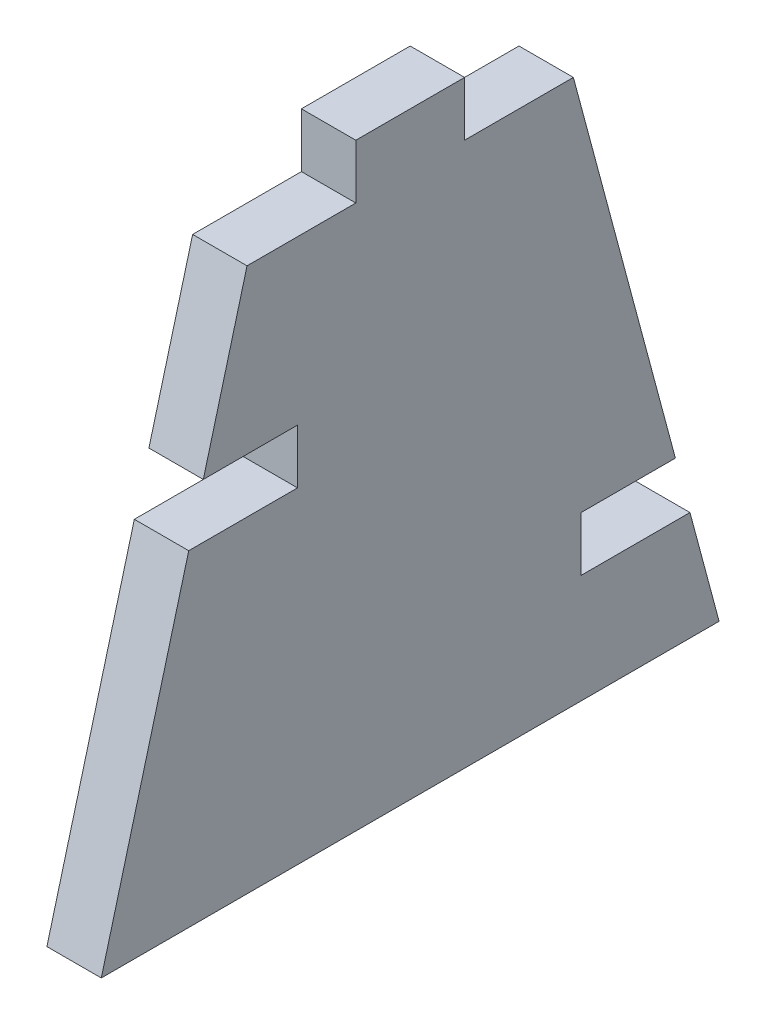
ISO-10303-21;
HEADER;
FILE_DESCRIPTION(('STEP AP214'),'2;1');
FILE_NAME('part.step','',(''),(''),'','','');
FILE_SCHEMA(('AUTOMOTIVE_DESIGN { 1 0 10303 214 1 1 1 1 }'));
ENDSEC;
DATA;
#1=APPLICATION_CONTEXT('core data for automotive mechanical design processes');
#2=APPLICATION_PROTOCOL_DEFINITION('international standard','automotive_design',2000,#1);
#3=PRODUCT_CONTEXT('',#1,'mechanical');
#4=PRODUCT('Part','Part','',(#3));
#5=PRODUCT_RELATED_PRODUCT_CATEGORY('part','',(#4));
#6=PRODUCT_DEFINITION_FORMATION('','',#4);
#7=PRODUCT_DEFINITION_CONTEXT('part definition',#1,'design');
#8=PRODUCT_DEFINITION('design','',#6,#7);
#9=PRODUCT_DEFINITION_SHAPE('','',#8);
#10=(LENGTH_UNIT() NAMED_UNIT(*) SI_UNIT(.MILLI.,.METRE.));
#11=(NAMED_UNIT(*) PLANE_ANGLE_UNIT() SI_UNIT($,.RADIAN.));
#12=(NAMED_UNIT(*) SI_UNIT($,.STERADIAN.) SOLID_ANGLE_UNIT());
#13=UNCERTAINTY_MEASURE_WITH_UNIT(LENGTH_MEASURE(1.E-05),#10,'distance_accuracy_value','');
#14=(GEOMETRIC_REPRESENTATION_CONTEXT(3) GLOBAL_UNCERTAINTY_ASSIGNED_CONTEXT((#13)) GLOBAL_UNIT_ASSIGNED_CONTEXT((#10,
#11,#12)) REPRESENTATION_CONTEXT('',''));
#15=CARTESIAN_POINT('',(0.,0.,0.));
#16=DIRECTION('',(0.,0.,1.));
#17=DIRECTION('',(1.,0.,0.));
#18=AXIS2_PLACEMENT_3D('',#15,#16,#17);
#19=CARTESIAN_POINT('',(10.,0.,56.7949192431127));
#20=DIRECTION('',(0.,-0.258819045102525,-0.965925826289067));
#21=DIRECTION('',(0.,0.965925826289067,-0.258819045102525));
#22=AXIS2_PLACEMENT_3D('',#19,#20,#21);
#23=PLANE('',#22);
#24=DIRECTION('',(0.,-0.965925826289067,0.258819045102524));
#25=VECTOR('',#24,1.);
#26=CARTESIAN_POINT('',(0.,0.,56.7949192431127));
#27=LINE('',#26,#25);
#28=CARTESIAN_POINT('',(0.,60.,40.7179676972451));
#29=VERTEX_POINT('',#28);
#30=CARTESIAN_POINT('',(0.,0.,56.7949192431127));
#31=VERTEX_POINT('',#30);
#32=EDGE_CURVE('E178',#29,#31,#27,.T.);
#33=ORIENTED_EDGE('',*,*,#32,.T.);
#34=DIRECTION('',(-1.,0.,0.));
#35=VECTOR('',#34,1.);
#36=CARTESIAN_POINT('',(10.,0.,56.7949192431127));
#37=LINE('',#36,#35);
#38=CARTESIAN_POINT('',(10.,0.,56.7949192431127));
#39=VERTEX_POINT('',#38);
#40=EDGE_CURVE('E11',#39,#31,#37,.T.);
#41=ORIENTED_EDGE('',*,*,#40,.F.);
#42=DIRECTION('',(0.,-0.965925826289067,0.258819045102524));
#43=VECTOR('',#42,1.);
#44=CARTESIAN_POINT('',(10.,0.,56.7949192431127));
#45=LINE('',#44,#43);
#46=CARTESIAN_POINT('',(10.,60.,40.7179676972451));
#47=VERTEX_POINT('',#46);
#48=EDGE_CURVE('E208',#47,#39,#45,.T.);
#49=ORIENTED_EDGE('',*,*,#48,.F.);
#50=DIRECTION('',(-1.,0.,0.));
#51=VECTOR('',#50,1.);
#52=CARTESIAN_POINT('',(10.,60.,40.7179676972451));
#53=LINE('',#52,#51);
#54=EDGE_CURVE('E174',#47,#29,#53,.T.);
#55=ORIENTED_EDGE('',*,*,#54,.T.);
#56=EDGE_LOOP('',(#33,#41,#49,#55));
#57=FACE_BOUND('',#56,.T.);
#58=ADVANCED_FACE('F34',(#57),#23,.F.);
#59=CARTESIAN_POINT('',(10.,0.,-56.7949192431127));
#60=DIRECTION('',(0.,1.,0.));
#61=DIRECTION('',(0.,0.,1.));
#62=AXIS2_PLACEMENT_3D('',#59,#60,#61);
#63=PLANE('',#62);
#64=DIRECTION('',(0.,0.,-1.));
#65=VECTOR('',#64,1.);
#66=CARTESIAN_POINT('',(0.,0.,-56.7949192431127));
#67=LINE('',#66,#65);
#68=CARTESIAN_POINT('',(0.,0.,-56.7949192431127));
#69=VERTEX_POINT('',#68);
#70=EDGE_CURVE('E181',#31,#69,#67,.T.);
#71=ORIENTED_EDGE('',*,*,#70,.T.);
#72=DIRECTION('',(-1.,0.,0.));
#73=VECTOR('',#72,1.);
#74=CARTESIAN_POINT('',(10.,0.,-56.7949192431127));
#75=LINE('',#74,#73);
#76=CARTESIAN_POINT('',(10.,0.,-56.7949192431127));
#77=VERTEX_POINT('',#76);
#78=EDGE_CURVE('E42',#77,#69,#75,.T.);
#79=ORIENTED_EDGE('',*,*,#78,.F.);
#80=DIRECTION('',(0.,0.,-1.));
#81=VECTOR('',#80,1.);
#82=CARTESIAN_POINT('',(10.,0.,-56.7949192431127));
#83=LINE('',#82,#81);
#84=EDGE_CURVE('E117',#39,#77,#83,.T.);
#85=ORIENTED_EDGE('',*,*,#84,.F.);
#86=ORIENTED_EDGE('',*,*,#40,.T.);
#87=EDGE_LOOP('',(#71,#79,#85,#86));
#88=FACE_BOUND('',#87,.T.);
#89=ADVANCED_FACE('F306',(#88),#63,.F.);
#90=CARTESIAN_POINT('',(10.,0.,-56.7949192431127));
#91=DIRECTION('',(0.,-0.258819045102525,0.965925826289067));
#92=DIRECTION('',(0.,-0.965925826289067,-0.258819045102525));
#93=AXIS2_PLACEMENT_3D('',#90,#91,#92);
#94=PLANE('',#93);
#95=DIRECTION('',(0.,0.965925826289067,0.258819045102525));
#96=VECTOR('',#95,1.);
#97=CARTESIAN_POINT('',(0.,0.,-56.7949192431127));
#98=LINE('',#97,#96);
#99=CARTESIAN_POINT('',(0.,20.,-51.4359353944902));
#100=VERTEX_POINT('',#99);
#101=EDGE_CURVE('E183',#69,#100,#98,.T.);
#102=ORIENTED_EDGE('',*,*,#101,.T.);
#103=DIRECTION('',(-1.,0.,0.));
#104=VECTOR('',#103,1.);
#105=CARTESIAN_POINT('',(10.,20.,-51.4359353944902));
#106=LINE('',#105,#104);
#107=CARTESIAN_POINT('',(10.,20.,-51.4359353944902));
#108=VERTEX_POINT('',#107);
#109=EDGE_CURVE('E239',#108,#100,#106,.T.);
#110=ORIENTED_EDGE('',*,*,#109,.F.);
#111=DIRECTION('',(0.,0.965925826289067,0.258819045102525));
#112=VECTOR('',#111,1.);
#113=CARTESIAN_POINT('',(10.,0.,-56.7949192431127));
#114=LINE('',#113,#112);
#115=EDGE_CURVE('E247',#77,#108,#114,.T.);
#116=ORIENTED_EDGE('',*,*,#115,.F.);
#117=ORIENTED_EDGE('',*,*,#78,.T.);
#118=EDGE_LOOP('',(#102,#110,#116,#117));
#119=FACE_BOUND('',#118,.T.);
#120=ADVANCED_FACE('F245',(#119),#94,.F.);
#121=CARTESIAN_POINT('',(10.,20.,-31.4359353944901));
#122=DIRECTION('',(0.,-1.,0.));
#123=DIRECTION('',(0.,0.,-1.));
#124=AXIS2_PLACEMENT_3D('',#121,#122,#123);
#125=PLANE('',#124);
#126=DIRECTION('',(0.,0.,1.));
#127=VECTOR('',#126,1.);
#128=CARTESIAN_POINT('',(0.,20.,-31.4359353944901));
#129=LINE('',#128,#127);
#130=CARTESIAN_POINT('',(0.,20.,-31.4359353944901));
#131=VERTEX_POINT('',#130);
#132=EDGE_CURVE('E185',#100,#131,#129,.T.);
#133=ORIENTED_EDGE('',*,*,#132,.T.);
#134=DIRECTION('',(-1.,0.,0.));
#135=VECTOR('',#134,1.);
#136=CARTESIAN_POINT('',(10.,20.,-31.4359353944901));
#137=LINE('',#136,#135);
#138=CARTESIAN_POINT('',(10.,20.,-31.4359353944901));
#139=VERTEX_POINT('',#138);
#140=EDGE_CURVE('E236',#139,#131,#137,.T.);
#141=ORIENTED_EDGE('',*,*,#140,.F.);
#142=DIRECTION('',(0.,0.,1.));
#143=VECTOR('',#142,1.);
#144=CARTESIAN_POINT('',(10.,20.,-31.4359353944901));
#145=LINE('',#144,#143);
#146=EDGE_CURVE('E265',#108,#139,#145,.T.);
#147=ORIENTED_EDGE('',*,*,#146,.F.);
#148=ORIENTED_EDGE('',*,*,#109,.T.);
#149=EDGE_LOOP('',(#133,#141,#147,#148));
#150=FACE_BOUND('',#149,.T.);
#151=ADVANCED_FACE('F256',(#150),#125,.F.);
#152=CARTESIAN_POINT('',(10.,30.,-31.4359353944901));
#153=DIRECTION('',(0.,0.,1.));
#154=DIRECTION('',(1.,0.,0.));
#155=AXIS2_PLACEMENT_3D('',#152,#153,#154);
#156=PLANE('',#155);
#157=DIRECTION('',(0.,1.,0.));
#158=VECTOR('',#157,1.);
#159=CARTESIAN_POINT('',(0.,30.,-31.4359353944901));
#160=LINE('',#159,#158);
#161=CARTESIAN_POINT('',(0.,30.,-31.4359353944901));
#162=VERTEX_POINT('',#161);
#163=EDGE_CURVE('E187',#131,#162,#160,.T.);
#164=ORIENTED_EDGE('',*,*,#163,.T.);
#165=DIRECTION('',(-1.,0.,0.));
#166=VECTOR('',#165,1.);
#167=CARTESIAN_POINT('',(10.,30.,-31.4359353944901));
#168=LINE('',#167,#166);
#169=CARTESIAN_POINT('',(10.,30.,-31.4359353944901));
#170=VERTEX_POINT('',#169);
#171=EDGE_CURVE('E233',#170,#162,#168,.T.);
#172=ORIENTED_EDGE('',*,*,#171,.F.);
#173=DIRECTION('',(0.,1.,0.));
#174=VECTOR('',#173,1.);
#175=CARTESIAN_POINT('',(10.,30.,-31.4359353944901));
#176=LINE('',#175,#174);
#177=EDGE_CURVE('E262',#139,#170,#176,.T.);
#178=ORIENTED_EDGE('',*,*,#177,.F.);
#179=ORIENTED_EDGE('',*,*,#140,.T.);
#180=EDGE_LOOP('',(#164,#172,#178,#179));
#181=FACE_BOUND('',#180,.T.);
#182=ADVANCED_FACE('F260',(#181),#156,.F.);
#183=CARTESIAN_POINT('',(10.,30.,-48.7564434701789));
#184=DIRECTION('',(0.,1.,0.));
#185=DIRECTION('',(0.,0.,1.));
#186=AXIS2_PLACEMENT_3D('',#183,#184,#185);
#187=PLANE('',#186);
#188=DIRECTION('',(0.,0.,-1.));
#189=VECTOR('',#188,1.);
#190=CARTESIAN_POINT('',(0.,30.,-48.7564434701789));
#191=LINE('',#190,#189);
#192=CARTESIAN_POINT('',(0.,30.,-48.7564434701789));
#193=VERTEX_POINT('',#192);
#194=EDGE_CURVE('E189',#162,#193,#191,.T.);
#195=ORIENTED_EDGE('',*,*,#194,.T.);
#196=DIRECTION('',(-1.,0.,0.));
#197=VECTOR('',#196,1.);
#198=CARTESIAN_POINT('',(10.,30.,-48.7564434701789));
#199=LINE('',#198,#197);
#200=CARTESIAN_POINT('',(10.,30.,-48.7564434701789));
#201=VERTEX_POINT('',#200);
#202=EDGE_CURVE('E230',#201,#193,#199,.T.);
#203=ORIENTED_EDGE('',*,*,#202,.F.);
#204=DIRECTION('',(0.,0.,-1.));
#205=VECTOR('',#204,1.);
#206=CARTESIAN_POINT('',(10.,30.,-48.7564434701789));
#207=LINE('',#206,#205);
#208=EDGE_CURVE('E264',#170,#201,#207,.T.);
#209=ORIENTED_EDGE('',*,*,#208,.F.);
#210=ORIENTED_EDGE('',*,*,#171,.T.);
#211=EDGE_LOOP('',(#195,#203,#209,#210));
#212=FACE_BOUND('',#211,.T.);
#213=ADVANCED_FACE('F319',(#212),#187,.F.);
#214=CARTESIAN_POINT('',(10.,30.,-48.7564434701789));
#215=DIRECTION('',(0.,-0.258819045102525,0.965925826289067));
#216=DIRECTION('',(0.,-0.965925826289067,-0.258819045102525));
#217=AXIS2_PLACEMENT_3D('',#214,#215,#216);
#218=PLANE('',#217);
#219=DIRECTION('',(0.,0.965925826289067,0.258819045102525));
#220=VECTOR('',#219,1.);
#221=CARTESIAN_POINT('',(0.,30.,-48.7564434701789));
#222=LINE('',#221,#220);
#223=CARTESIAN_POINT('',(0.,100.,-30.));
#224=VERTEX_POINT('',#223);
#225=EDGE_CURVE('E191',#193,#224,#222,.T.);
#226=ORIENTED_EDGE('',*,*,#225,.T.);
#227=DIRECTION('',(-1.,0.,0.));
#228=VECTOR('',#227,1.);
#229=CARTESIAN_POINT('',(10.,100.,-30.));
#230=LINE('',#229,#228);
#231=CARTESIAN_POINT('',(10.,100.,-30.));
#232=VERTEX_POINT('',#231);
#233=EDGE_CURVE('E227',#232,#224,#230,.T.);
#234=ORIENTED_EDGE('',*,*,#233,.F.);
#235=DIRECTION('',(0.,0.965925826289067,0.258819045102525));
#236=VECTOR('',#235,1.);
#237=CARTESIAN_POINT('',(10.,30.,-48.7564434701789));
#238=LINE('',#237,#236);
#239=EDGE_CURVE('E267',#201,#232,#238,.T.);
#240=ORIENTED_EDGE('',*,*,#239,.F.);
#241=ORIENTED_EDGE('',*,*,#202,.T.);
#242=EDGE_LOOP('',(#226,#234,#240,#241));
#243=FACE_BOUND('',#242,.T.);
#244=ADVANCED_FACE('F322',(#243),#218,.F.);
#245=CARTESIAN_POINT('',(10.,100.,-30.));
#246=DIRECTION('',(0.,-1.,0.));
#247=DIRECTION('',(0.,0.,-1.));
#248=AXIS2_PLACEMENT_3D('',#245,#246,#247);
#249=PLANE('',#248);
#250=DIRECTION('',(0.,0.,1.));
#251=VECTOR('',#250,1.);
#252=CARTESIAN_POINT('',(0.,100.,-30.));
#253=LINE('',#252,#251);
#254=CARTESIAN_POINT('',(0.,100.,-10.));
#255=VERTEX_POINT('',#254);
#256=EDGE_CURVE('E193',#224,#255,#253,.T.);
#257=ORIENTED_EDGE('',*,*,#256,.T.);
#258=DIRECTION('',(-1.,0.,0.));
#259=VECTOR('',#258,1.);
#260=CARTESIAN_POINT('',(10.,100.,-10.));
#261=LINE('',#260,#259);
#262=CARTESIAN_POINT('',(10.,100.,-10.));
#263=VERTEX_POINT('',#262);
#264=EDGE_CURVE('E224',#263,#255,#261,.T.);
#265=ORIENTED_EDGE('',*,*,#264,.F.);
#266=DIRECTION('',(0.,0.,1.));
#267=VECTOR('',#266,1.);
#268=CARTESIAN_POINT('',(10.,100.,-30.));
#269=LINE('',#268,#267);
#270=EDGE_CURVE('E273',#232,#263,#269,.T.);
#271=ORIENTED_EDGE('',*,*,#270,.F.);
#272=ORIENTED_EDGE('',*,*,#233,.T.);
#273=EDGE_LOOP('',(#257,#265,#271,#272));
#274=FACE_BOUND('',#273,.T.);
#275=ADVANCED_FACE('F326',(#274),#249,.F.);
#276=CARTESIAN_POINT('',(10.,100.,-10.));
#277=DIRECTION('',(0.,0.,1.));
#278=DIRECTION('',(1.,0.,0.));
#279=AXIS2_PLACEMENT_3D('',#276,#277,#278);
#280=PLANE('',#279);
#281=DIRECTION('',(0.,1.,0.));
#282=VECTOR('',#281,1.);
#283=CARTESIAN_POINT('',(0.,100.,-10.));
#284=LINE('',#283,#282);
#285=CARTESIAN_POINT('',(0.,110.,-10.));
#286=VERTEX_POINT('',#285);
#287=EDGE_CURVE('E195',#255,#286,#284,.T.);
#288=ORIENTED_EDGE('',*,*,#287,.T.);
#289=DIRECTION('',(-1.,0.,0.));
#290=VECTOR('',#289,1.);
#291=CARTESIAN_POINT('',(10.,110.,-10.));
#292=LINE('',#291,#290);
#293=CARTESIAN_POINT('',(10.,110.,-10.));
#294=VERTEX_POINT('',#293);
#295=EDGE_CURVE('E221',#294,#286,#292,.T.);
#296=ORIENTED_EDGE('',*,*,#295,.F.);
#297=DIRECTION('',(0.,1.,0.));
#298=VECTOR('',#297,1.);
#299=CARTESIAN_POINT('',(10.,100.,-10.));
#300=LINE('',#299,#298);
#301=EDGE_CURVE('E275',#263,#294,#300,.T.);
#302=ORIENTED_EDGE('',*,*,#301,.F.);
#303=ORIENTED_EDGE('',*,*,#264,.T.);
#304=EDGE_LOOP('',(#288,#296,#302,#303));
#305=FACE_BOUND('',#304,.T.);
#306=ADVANCED_FACE('F330',(#305),#280,.F.);
#307=CARTESIAN_POINT('',(10.,110.,10.));
#308=DIRECTION('',(0.,-1.,0.));
#309=DIRECTION('',(0.,0.,-1.));
#310=AXIS2_PLACEMENT_3D('',#307,#308,#309);
#311=PLANE('',#310);
#312=DIRECTION('',(0.,0.,1.));
#313=VECTOR('',#312,1.);
#314=CARTESIAN_POINT('',(0.,110.,10.));
#315=LINE('',#314,#313);
#316=CARTESIAN_POINT('',(0.,110.,10.));
#317=VERTEX_POINT('',#316);
#318=EDGE_CURVE('E197',#286,#317,#315,.T.);
#319=ORIENTED_EDGE('',*,*,#318,.T.);
#320=DIRECTION('',(-1.,0.,0.));
#321=VECTOR('',#320,1.);
#322=CARTESIAN_POINT('',(10.,110.,10.));
#323=LINE('',#322,#321);
#324=CARTESIAN_POINT('',(10.,110.,10.));
#325=VERTEX_POINT('',#324);
#326=EDGE_CURVE('E218',#325,#317,#323,.T.);
#327=ORIENTED_EDGE('',*,*,#326,.F.);
#328=DIRECTION('',(0.,0.,1.));
#329=VECTOR('',#328,1.);
#330=CARTESIAN_POINT('',(10.,110.,10.));
#331=LINE('',#330,#329);
#332=EDGE_CURVE('E277',#294,#325,#331,.T.);
#333=ORIENTED_EDGE('',*,*,#332,.F.);
#334=ORIENTED_EDGE('',*,*,#295,.T.);
#335=EDGE_LOOP('',(#319,#327,#333,#334));
#336=FACE_BOUND('',#335,.T.);
#337=ADVANCED_FACE('F334',(#336),#311,.F.);
#338=CARTESIAN_POINT('',(10.,100.,10.));
#339=DIRECTION('',(0.,0.,-1.));
#340=DIRECTION('',(-1.,0.,0.));
#341=AXIS2_PLACEMENT_3D('',#338,#339,#340);
#342=PLANE('',#341);
#343=DIRECTION('',(0.,-1.,0.));
#344=VECTOR('',#343,1.);
#345=CARTESIAN_POINT('',(0.,100.,10.));
#346=LINE('',#345,#344);
#347=CARTESIAN_POINT('',(0.,100.,10.));
#348=VERTEX_POINT('',#347);
#349=EDGE_CURVE('E199',#317,#348,#346,.T.);
#350=ORIENTED_EDGE('',*,*,#349,.T.);
#351=DIRECTION('',(-1.,0.,0.));
#352=VECTOR('',#351,1.);
#353=CARTESIAN_POINT('',(10.,100.,10.));
#354=LINE('',#353,#352);
#355=CARTESIAN_POINT('',(10.,100.,10.));
#356=VERTEX_POINT('',#355);
#357=EDGE_CURVE('E215',#356,#348,#354,.T.);
#358=ORIENTED_EDGE('',*,*,#357,.F.);
#359=DIRECTION('',(0.,-1.,0.));
#360=VECTOR('',#359,1.);
#361=CARTESIAN_POINT('',(10.,100.,10.));
#362=LINE('',#361,#360);
#363=EDGE_CURVE('E279',#325,#356,#362,.T.);
#364=ORIENTED_EDGE('',*,*,#363,.F.);
#365=ORIENTED_EDGE('',*,*,#326,.T.);
#366=EDGE_LOOP('',(#350,#358,#364,#365));
#367=FACE_BOUND('',#366,.T.);
#368=ADVANCED_FACE('F338',(#367),#342,.F.);
#369=CARTESIAN_POINT('',(10.,100.,30.));
#370=DIRECTION('',(0.,-1.,0.));
#371=DIRECTION('',(0.,0.,-1.));
#372=AXIS2_PLACEMENT_3D('',#369,#370,#371);
#373=PLANE('',#372);
#374=DIRECTION('',(0.,0.,1.));
#375=VECTOR('',#374,1.);
#376=CARTESIAN_POINT('',(0.,100.,30.));
#377=LINE('',#376,#375);
#378=CARTESIAN_POINT('',(0.,100.,30.));
#379=VERTEX_POINT('',#378);
#380=EDGE_CURVE('E201',#348,#379,#377,.T.);
#381=ORIENTED_EDGE('',*,*,#380,.T.);
#382=DIRECTION('',(-1.,0.,0.));
#383=VECTOR('',#382,1.);
#384=CARTESIAN_POINT('',(10.,100.,30.));
#385=LINE('',#384,#383);
#386=CARTESIAN_POINT('',(10.,100.,30.));
#387=VERTEX_POINT('',#386);
#388=EDGE_CURVE('E212',#387,#379,#385,.T.);
#389=ORIENTED_EDGE('',*,*,#388,.F.);
#390=DIRECTION('',(0.,0.,1.));
#391=VECTOR('',#390,1.);
#392=CARTESIAN_POINT('',(10.,100.,30.));
#393=LINE('',#392,#391);
#394=EDGE_CURVE('E281',#356,#387,#393,.T.);
#395=ORIENTED_EDGE('',*,*,#394,.F.);
#396=ORIENTED_EDGE('',*,*,#357,.T.);
#397=EDGE_LOOP('',(#381,#389,#395,#396));
#398=FACE_BOUND('',#397,.T.);
#399=ADVANCED_FACE('F287',(#398),#373,.F.);
#400=CARTESIAN_POINT('',(10.,70.,38.0384757729338));
#401=DIRECTION('',(0.,-0.258819045102524,-0.965925826289067));
#402=DIRECTION('',(0.,0.965925826289068,-0.258819045102524));
#403=AXIS2_PLACEMENT_3D('',#400,#401,#402);
#404=PLANE('',#403);
#405=DIRECTION('',(0.,-0.965925826289067,0.258819045102524));
#406=VECTOR('',#405,1.);
#407=CARTESIAN_POINT('',(0.,70.,38.0384757729338));
#408=LINE('',#407,#406);
#409=CARTESIAN_POINT('',(0.,70.,38.0384757729338));
#410=VERTEX_POINT('',#409);
#411=EDGE_CURVE('E203',#379,#410,#408,.T.);
#412=ORIENTED_EDGE('',*,*,#411,.T.);
#413=DIRECTION('',(-1.,0.,0.));
#414=VECTOR('',#413,1.);
#415=CARTESIAN_POINT('',(10.,70.,38.0384757729338));
#416=LINE('',#415,#414);
#417=CARTESIAN_POINT('',(10.,70.,38.0384757729338));
#418=VERTEX_POINT('',#417);
#419=EDGE_CURVE('E169',#418,#410,#416,.T.);
#420=ORIENTED_EDGE('',*,*,#419,.F.);
#421=DIRECTION('',(0.,-0.965925826289067,0.258819045102524));
#422=VECTOR('',#421,1.);
#423=CARTESIAN_POINT('',(10.,70.,38.0384757729338));
#424=LINE('',#423,#422);
#425=EDGE_CURVE('E160',#387,#418,#424,.T.);
#426=ORIENTED_EDGE('',*,*,#425,.F.);
#427=ORIENTED_EDGE('',*,*,#388,.T.);
#428=EDGE_LOOP('',(#412,#420,#426,#427));
#429=FACE_BOUND('',#428,.T.);
#430=ADVANCED_FACE('F291',(#429),#404,.F.);
#431=CARTESIAN_POINT('',(10.,70.,38.0384757729338));
#432=DIRECTION('',(0.,1.,0.));
#433=DIRECTION('',(0.,0.,1.));
#434=AXIS2_PLACEMENT_3D('',#431,#432,#433);
#435=PLANE('',#434);
#436=DIRECTION('',(0.,0.,-1.));
#437=VECTOR('',#436,1.);
#438=CARTESIAN_POINT('',(0.,70.,38.0384757729338));
#439=LINE('',#438,#437);
#440=CARTESIAN_POINT('',(0.,70.,20.7179676972451));
#441=VERTEX_POINT('',#440);
#442=EDGE_CURVE('E168',#410,#441,#439,.T.);
#443=ORIENTED_EDGE('',*,*,#442,.T.);
#444=DIRECTION('',(-1.,0.,0.));
#445=VECTOR('',#444,1.);
#446=CARTESIAN_POINT('',(10.,70.,20.7179676972451));
#447=LINE('',#446,#445);
#448=CARTESIAN_POINT('',(10.,70.,20.7179676972451));
#449=VERTEX_POINT('',#448);
#450=EDGE_CURVE('E165',#449,#441,#447,.T.);
#451=ORIENTED_EDGE('',*,*,#450,.F.);
#452=DIRECTION('',(0.,0.,-1.));
#453=VECTOR('',#452,1.);
#454=CARTESIAN_POINT('',(10.,70.,38.0384757729338));
#455=LINE('',#454,#453);
#456=EDGE_CURVE('E154',#418,#449,#455,.T.);
#457=ORIENTED_EDGE('',*,*,#456,.F.);
#458=ORIENTED_EDGE('',*,*,#419,.T.);
#459=EDGE_LOOP('',(#443,#451,#457,#458));
#460=FACE_BOUND('',#459,.T.);
#461=ADVANCED_FACE('F166',(#460),#435,.F.);
#462=CARTESIAN_POINT('',(10.,70.,20.7179676972451));
#463=DIRECTION('',(0.,0.,-1.));
#464=DIRECTION('',(0.,1.,0.));
#465=AXIS2_PLACEMENT_3D('',#462,#463,#464);
#466=PLANE('',#465);
#467=DIRECTION('',(0.,-1.,0.));
#468=VECTOR('',#467,1.);
#469=CARTESIAN_POINT('',(0.,70.,20.7179676972451));
#470=LINE('',#469,#468);
#471=CARTESIAN_POINT('',(0.,60.,20.7179676972451));
#472=VERTEX_POINT('',#471);
#473=EDGE_CURVE('E103',#441,#472,#470,.T.);
#474=ORIENTED_EDGE('',*,*,#473,.T.);
#475=DIRECTION('',(-1.,0.,0.));
#476=VECTOR('',#475,1.);
#477=CARTESIAN_POINT('',(10.,60.,20.7179676972451));
#478=LINE('',#477,#476);
#479=CARTESIAN_POINT('',(10.,60.,20.7179676972451));
#480=VERTEX_POINT('',#479);
#481=EDGE_CURVE('E170',#480,#472,#478,.T.);
#482=ORIENTED_EDGE('',*,*,#481,.F.);
#483=DIRECTION('',(0.,-1.,0.));
#484=VECTOR('',#483,1.);
#485=CARTESIAN_POINT('',(10.,70.,20.7179676972451));
#486=LINE('',#485,#484);
#487=EDGE_CURVE('E158',#449,#480,#486,.T.);
#488=ORIENTED_EDGE('',*,*,#487,.F.);
#489=ORIENTED_EDGE('',*,*,#450,.T.);
#490=EDGE_LOOP('',(#474,#482,#488,#489));
#491=FACE_BOUND('',#490,.T.);
#492=ADVANCED_FACE('F172',(#491),#466,.F.);
#493=CARTESIAN_POINT('',(10.,60.,20.7179676972451));
#494=DIRECTION('',(0.,-1.,0.));
#495=DIRECTION('',(0.,0.,-1.));
#496=AXIS2_PLACEMENT_3D('',#493,#494,#495);
#497=PLANE('',#496);
#498=DIRECTION('',(0.,0.,1.));
#499=VECTOR('',#498,1.);
#500=CARTESIAN_POINT('',(0.,60.,20.7179676972451));
#501=LINE('',#500,#499);
#502=EDGE_CURVE('E109',#472,#29,#501,.T.);
#503=ORIENTED_EDGE('',*,*,#502,.T.);
#504=ORIENTED_EDGE('',*,*,#54,.F.);
#505=DIRECTION('',(0.,0.,1.));
#506=VECTOR('',#505,1.);
#507=CARTESIAN_POINT('',(10.,60.,20.7179676972451));
#508=LINE('',#507,#506);
#509=EDGE_CURVE('E50',#480,#47,#508,.T.);
#510=ORIENTED_EDGE('',*,*,#509,.F.);
#511=ORIENTED_EDGE('',*,*,#481,.T.);
#512=EDGE_LOOP('',(#503,#504,#510,#511));
#513=FACE_BOUND('',#512,.T.);
#514=ADVANCED_FACE('F295',(#513),#497,.F.);
#515=CARTESIAN_POINT('',(10.,0.,0.));
#516=DIRECTION('',(1.,0.,0.));
#517=DIRECTION('',(0.,0.,-1.));
#518=AXIS2_PLACEMENT_3D('',#515,#516,#517);
#519=PLANE('',#518);
#520=ORIENTED_EDGE('',*,*,#48,.T.);
#521=ORIENTED_EDGE('',*,*,#84,.T.);
#522=ORIENTED_EDGE('',*,*,#115,.T.);
#523=ORIENTED_EDGE('',*,*,#146,.T.);
#524=ORIENTED_EDGE('',*,*,#177,.T.);
#525=ORIENTED_EDGE('',*,*,#208,.T.);
#526=ORIENTED_EDGE('',*,*,#239,.T.);
#527=ORIENTED_EDGE('',*,*,#270,.T.);
#528=ORIENTED_EDGE('',*,*,#301,.T.);
#529=ORIENTED_EDGE('',*,*,#332,.T.);
#530=ORIENTED_EDGE('',*,*,#363,.T.);
#531=ORIENTED_EDGE('',*,*,#394,.T.);
#532=ORIENTED_EDGE('',*,*,#425,.T.);
#533=ORIENTED_EDGE('',*,*,#456,.T.);
#534=ORIENTED_EDGE('',*,*,#487,.T.);
#535=ORIENTED_EDGE('',*,*,#509,.T.);
#536=EDGE_LOOP('',(#520,#521,#522,#523,#524,#525,#526,#527,#528,#529,#530,#531,#532,#533,#534,#535));
#537=FACE_BOUND('',#536,.T.);
#538=ADVANCED_FACE('F156',(#537),#519,.T.);
#539=CARTESIAN_POINT('',(0.,0.,0.));
#540=DIRECTION('',(1.,0.,0.));
#541=DIRECTION('',(0.,0.,-1.));
#542=AXIS2_PLACEMENT_3D('',#539,#540,#541);
#543=PLANE('',#542);
#544=ORIENTED_EDGE('',*,*,#32,.F.);
#545=ORIENTED_EDGE('',*,*,#502,.F.);
#546=ORIENTED_EDGE('',*,*,#473,.F.);
#547=ORIENTED_EDGE('',*,*,#442,.F.);
#548=ORIENTED_EDGE('',*,*,#411,.F.);
#549=ORIENTED_EDGE('',*,*,#380,.F.);
#550=ORIENTED_EDGE('',*,*,#349,.F.);
#551=ORIENTED_EDGE('',*,*,#318,.F.);
#552=ORIENTED_EDGE('',*,*,#287,.F.);
#553=ORIENTED_EDGE('',*,*,#256,.F.);
#554=ORIENTED_EDGE('',*,*,#225,.F.);
#555=ORIENTED_EDGE('',*,*,#194,.F.);
#556=ORIENTED_EDGE('',*,*,#163,.F.);
#557=ORIENTED_EDGE('',*,*,#132,.F.);
#558=ORIENTED_EDGE('',*,*,#101,.F.);
#559=ORIENTED_EDGE('',*,*,#70,.F.);
#560=EDGE_LOOP('',(#544,#545,#546,#547,#548,#549,#550,#551,#552,#553,#554,#555,#556,#557,#558,#559));
#561=FACE_BOUND('',#560,.T.);
#562=ADVANCED_FACE('F251',(#561),#543,.F.);
#563=CLOSED_SHELL('',(#58,#89,#120,#151,#182,#213,#244,#275,#306,#337,#368,#399,#430,#461,#492,
#514,#538,#562));
#564=MANIFOLD_SOLID_BREP('B2',#563);
#565=ADVANCED_BREP_SHAPE_REPRESENTATION('',(#18,#564),#14);
#566=SHAPE_DEFINITION_REPRESENTATION(#9,#565);
ENDSEC;
END-ISO-10303-21;
